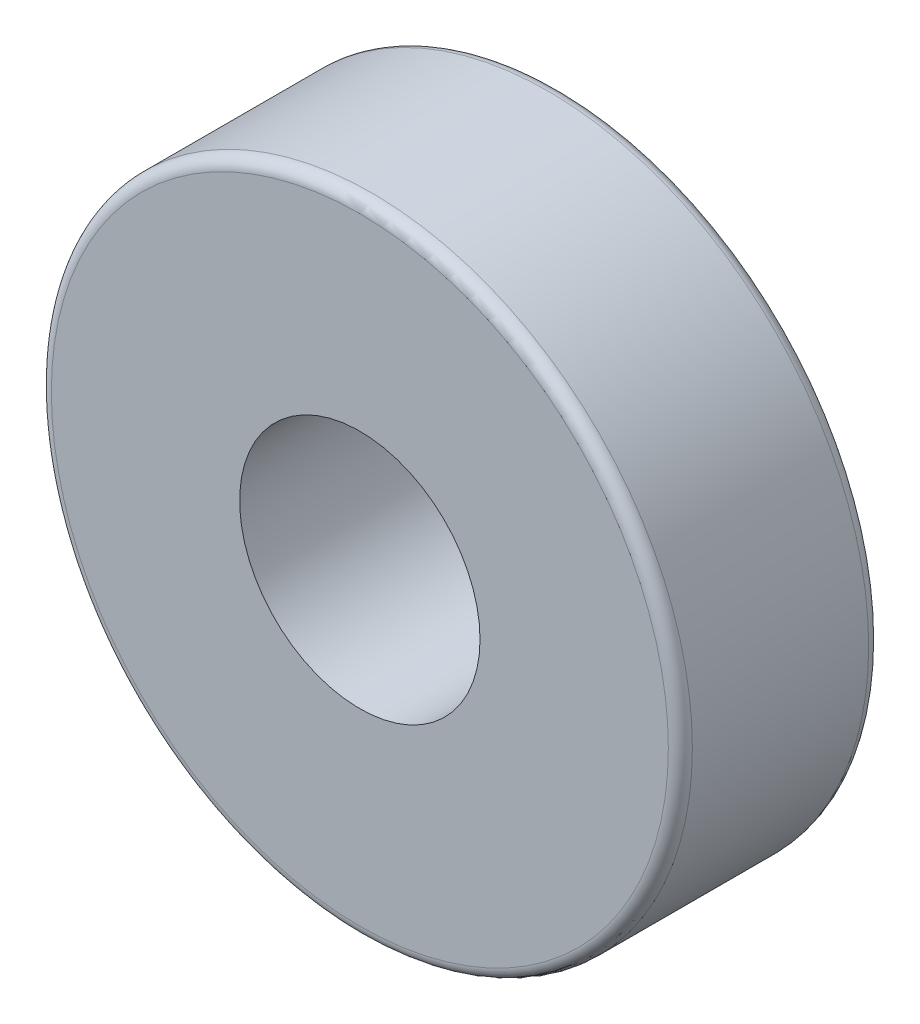
ISO-10303-21;
HEADER;
FILE_DESCRIPTION(('STEP AP214'),'2;1');
FILE_NAME('part.step','',(''),(''),'','','');
FILE_SCHEMA(('AUTOMOTIVE_DESIGN { 1 0 10303 214 1 1 1 1 }'));
ENDSEC;
DATA;
#1=APPLICATION_CONTEXT('core data for automotive mechanical design processes');
#2=APPLICATION_PROTOCOL_DEFINITION('international standard','automotive_design',2000,#1);
#3=PRODUCT_CONTEXT('',#1,'mechanical');
#4=PRODUCT('Part','Part','',(#3));
#5=PRODUCT_RELATED_PRODUCT_CATEGORY('part','',(#4));
#6=PRODUCT_DEFINITION_FORMATION('','',#4);
#7=PRODUCT_DEFINITION_CONTEXT('part definition',#1,'design');
#8=PRODUCT_DEFINITION('design','',#6,#7);
#9=PRODUCT_DEFINITION_SHAPE('','',#8);
#10=(LENGTH_UNIT() NAMED_UNIT(*) SI_UNIT(.MILLI.,.METRE.));
#11=(NAMED_UNIT(*) PLANE_ANGLE_UNIT() SI_UNIT($,.RADIAN.));
#12=(NAMED_UNIT(*) SI_UNIT($,.STERADIAN.) SOLID_ANGLE_UNIT());
#13=UNCERTAINTY_MEASURE_WITH_UNIT(LENGTH_MEASURE(1.E-05),#10,'distance_accuracy_value','');
#14=(GEOMETRIC_REPRESENTATION_CONTEXT(3) GLOBAL_UNCERTAINTY_ASSIGNED_CONTEXT((#13)) GLOBAL_UNIT_ASSIGNED_CONTEXT((#10,
#11,#12)) REPRESENTATION_CONTEXT('',''));
#15=CARTESIAN_POINT('',(0.,0.,0.));
#16=DIRECTION('',(0.,0.,1.));
#17=DIRECTION('',(1.,0.,0.));
#18=AXIS2_PLACEMENT_3D('',#15,#16,#17);
#19=CARTESIAN_POINT('',(0.,0.,2.5));
#20=DIRECTION('',(0.,0.,1.));
#21=DIRECTION('',(1.,0.,0.));
#22=AXIS2_PLACEMENT_3D('',#19,#20,#21);
#23=PLANE('',#22);
#24=CARTESIAN_POINT('',(0.,0.,2.5));
#25=DIRECTION('',(0.,0.,1.));
#26=DIRECTION('',(1.,0.,0.));
#27=AXIS2_PLACEMENT_3D('',#24,#25,#26);
#28=CIRCLE('',#27,7.7);
#29=CARTESIAN_POINT('',(7.7,0.,2.5));
#30=VERTEX_POINT('',#29);
#31=EDGE_CURVE('E50',#30,#30,#28,.T.);
#32=ORIENTED_EDGE('',*,*,#31,.T.);
#33=EDGE_LOOP('',(#32));
#34=FACE_BOUND('',#33,.T.);
#35=CARTESIAN_POINT('',(0.,0.,2.5));
#36=DIRECTION('',(0.,0.,1.));
#37=DIRECTION('',(1.,0.,0.));
#38=AXIS2_PLACEMENT_3D('',#35,#36,#37);
#39=CIRCLE('',#38,3.);
#40=CARTESIAN_POINT('',(3.,0.,2.5));
#41=VERTEX_POINT('',#40);
#42=EDGE_CURVE('E69',#41,#41,#39,.T.);
#43=ORIENTED_EDGE('',*,*,#42,.F.);
#44=EDGE_LOOP('',(#43));
#45=FACE_BOUND('',#44,.T.);
#46=ADVANCED_FACE('F37',(#34,#45),#23,.T.);
#47=CARTESIAN_POINT('',(0.,0.,-2.5));
#48=DIRECTION('',(0.,0.,1.));
#49=DIRECTION('',(1.,0.,0.));
#50=AXIS2_PLACEMENT_3D('',#47,#48,#49);
#51=PLANE('',#50);
#52=CARTESIAN_POINT('',(0.,0.,-2.5));
#53=DIRECTION('',(0.,0.,1.));
#54=DIRECTION('',(1.,0.,0.));
#55=AXIS2_PLACEMENT_3D('',#52,#53,#54);
#56=CIRCLE('',#55,3.3);
#57=CARTESIAN_POINT('',(3.3,0.,-2.5));
#58=VERTEX_POINT('',#57);
#59=EDGE_CURVE('E61',#58,#58,#56,.T.);
#60=ORIENTED_EDGE('',*,*,#59,.T.);
#61=EDGE_LOOP('',(#60));
#62=FACE_BOUND('',#61,.T.);
#63=CARTESIAN_POINT('',(0.,0.,-2.5));
#64=DIRECTION('',(0.,0.,1.));
#65=DIRECTION('',(1.,0.,0.));
#66=AXIS2_PLACEMENT_3D('',#63,#64,#65);
#67=CIRCLE('',#66,7.7);
#68=CARTESIAN_POINT('',(7.7,0.,-2.5));
#69=VERTEX_POINT('',#68);
#70=EDGE_CURVE('E65',#69,#69,#67,.F.);
#71=ORIENTED_EDGE('',*,*,#70,.T.);
#72=EDGE_LOOP('',(#71));
#73=FACE_BOUND('',#72,.T.);
#74=ADVANCED_FACE('F77',(#62,#73),#51,.F.);
#75=CARTESIAN_POINT('',(0.,0.,2.5));
#76=DIRECTION('',(0.,0.,-1.));
#77=DIRECTION('',(-1.,0.,0.));
#78=AXIS2_PLACEMENT_3D('',#75,#76,#77);
#79=CYLINDRICAL_SURFACE('',#78,8.);
#80=CARTESIAN_POINT('',(0.,0.,2.2));
#81=DIRECTION('',(0.,0.,1.));
#82=DIRECTION('',(1.,0.,0.));
#83=AXIS2_PLACEMENT_3D('',#80,#81,#82);
#84=CIRCLE('',#83,8.);
#85=CARTESIAN_POINT('',(8.,0.,2.2));
#86=VERTEX_POINT('',#85);
#87=EDGE_CURVE('E10',#86,#86,#84,.F.);
#88=ORIENTED_EDGE('',*,*,#87,.T.);
#89=EDGE_LOOP('',(#88));
#90=FACE_BOUND('',#89,.T.);
#91=CARTESIAN_POINT('',(0.,0.,-2.2));
#92=DIRECTION('',(0.,0.,1.));
#93=DIRECTION('',(1.,0.,0.));
#94=AXIS2_PLACEMENT_3D('',#91,#92,#93);
#95=CIRCLE('',#94,8.);
#96=CARTESIAN_POINT('',(8.,0.,-2.2));
#97=VERTEX_POINT('',#96);
#98=EDGE_CURVE('E45',#97,#97,#95,.T.);
#99=ORIENTED_EDGE('',*,*,#98,.T.);
#100=EDGE_LOOP('',(#99));
#101=FACE_BOUND('',#100,.T.);
#102=ADVANCED_FACE('F83',(#90,#101),#79,.T.);
#103=CARTESIAN_POINT('',(0.,0.,2.5));
#104=DIRECTION('',(0.,0.,-1.));
#105=DIRECTION('',(-1.,0.,0.));
#106=AXIS2_PLACEMENT_3D('',#103,#104,#105);
#107=CYLINDRICAL_SURFACE('',#106,3.);
#108=CARTESIAN_POINT('',(0.,0.,-2.2));
#109=DIRECTION('',(0.,0.,1.));
#110=DIRECTION('',(1.,0.,0.));
#111=AXIS2_PLACEMENT_3D('',#108,#109,#110);
#112=CIRCLE('',#111,3.);
#113=CARTESIAN_POINT('',(3.,0.,-2.2));
#114=VERTEX_POINT('',#113);
#115=EDGE_CURVE('E55',#114,#114,#112,.F.);
#116=ORIENTED_EDGE('',*,*,#115,.T.);
#117=EDGE_LOOP('',(#116));
#118=FACE_BOUND('',#117,.T.);
#119=ORIENTED_EDGE('',*,*,#42,.T.);
#120=EDGE_LOOP('',(#119));
#121=FACE_BOUND('',#120,.T.);
#122=ADVANCED_FACE('F74',(#118,#121),#107,.F.);
#123=CARTESIAN_POINT('',(0.,0.,-2.2));
#124=DIRECTION('',(0.,0.,1.));
#125=DIRECTION('',(1.,0.,0.));
#126=AXIS2_PLACEMENT_3D('',#123,#124,#125);
#127=TOROIDAL_SURFACE('',#126,3.3,0.3);
#128=ORIENTED_EDGE('',*,*,#115,.F.);
#129=EDGE_LOOP('',(#128));
#130=FACE_BOUND('',#129,.T.);
#131=ORIENTED_EDGE('',*,*,#59,.F.);
#132=EDGE_LOOP('',(#131));
#133=FACE_BOUND('',#132,.T.);
#134=ADVANCED_FACE('F90',(#130,#133),#127,.T.);
#135=CARTESIAN_POINT('',(0.,0.,2.2));
#136=DIRECTION('',(0.,0.,1.));
#137=DIRECTION('',(1.,0.,0.));
#138=AXIS2_PLACEMENT_3D('',#135,#136,#137);
#139=TOROIDAL_SURFACE('',#138,7.7,0.3);
#140=ORIENTED_EDGE('',*,*,#87,.F.);
#141=EDGE_LOOP('',(#140));
#142=FACE_BOUND('',#141,.T.);
#143=ORIENTED_EDGE('',*,*,#31,.F.);
#144=EDGE_LOOP('',(#143));
#145=FACE_BOUND('',#144,.T.);
#146=ADVANCED_FACE('F92',(#142,#145),#139,.T.);
#147=CARTESIAN_POINT('',(0.,0.,-2.2));
#148=DIRECTION('',(0.,0.,1.));
#149=DIRECTION('',(1.,0.,0.));
#150=AXIS2_PLACEMENT_3D('',#147,#148,#149);
#151=TOROIDAL_SURFACE('',#150,7.7,0.3);
#152=ORIENTED_EDGE('',*,*,#70,.F.);
#153=EDGE_LOOP('',(#152));
#154=FACE_BOUND('',#153,.T.);
#155=ORIENTED_EDGE('',*,*,#98,.F.);
#156=EDGE_LOOP('',(#155));
#157=FACE_BOUND('',#156,.T.);
#158=ADVANCED_FACE('F39',(#154,#157),#151,.T.);
#159=CLOSED_SHELL('',(#46,#74,#102,#122,#134,#146,#158));
#160=MANIFOLD_SOLID_BREP('B2',#159);
#161=ADVANCED_BREP_SHAPE_REPRESENTATION('',(#18,#160),#14);
#162=SHAPE_DEFINITION_REPRESENTATION(#9,#161);
ENDSEC;
END-ISO-10303-21;
